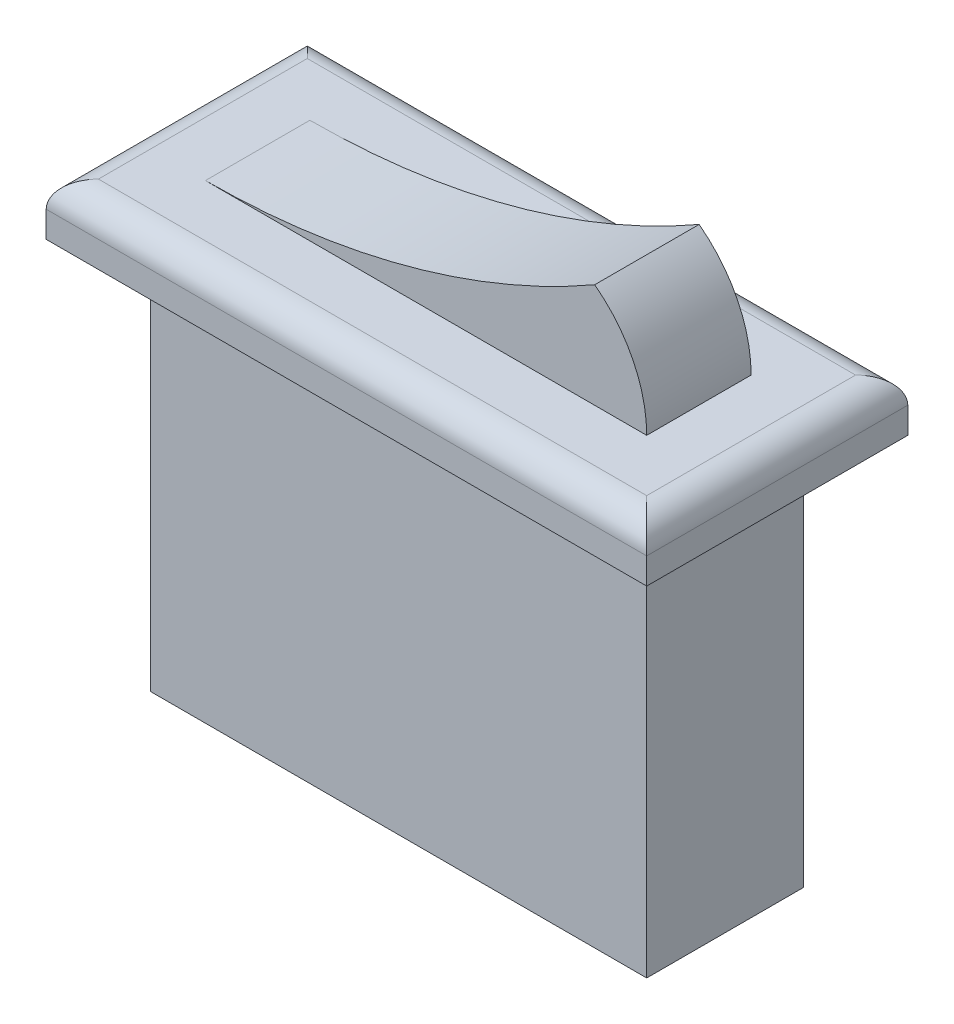
ISO-10303-21;
HEADER;
FILE_DESCRIPTION(('STEP AP214'),'2;1');
FILE_NAME('part.step','',(''),(''),'','','');
FILE_SCHEMA(('AUTOMOTIVE_DESIGN { 1 0 10303 214 1 1 1 1 }'));
ENDSEC;
DATA;
#1=APPLICATION_CONTEXT('core data for automotive mechanical design processes');
#2=APPLICATION_PROTOCOL_DEFINITION('international standard','automotive_design',2000,#1);
#3=PRODUCT_CONTEXT('',#1,'mechanical');
#4=PRODUCT('Part','Part','',(#3));
#5=PRODUCT_RELATED_PRODUCT_CATEGORY('part','',(#4));
#6=PRODUCT_DEFINITION_FORMATION('','',#4);
#7=PRODUCT_DEFINITION_CONTEXT('part definition',#1,'design');
#8=PRODUCT_DEFINITION('design','',#6,#7);
#9=PRODUCT_DEFINITION_SHAPE('','',#8);
#10=(LENGTH_UNIT() NAMED_UNIT(*) SI_UNIT(.MILLI.,.METRE.));
#11=(NAMED_UNIT(*) PLANE_ANGLE_UNIT() SI_UNIT($,.RADIAN.));
#12=(NAMED_UNIT(*) SI_UNIT($,.STERADIAN.) SOLID_ANGLE_UNIT());
#13=UNCERTAINTY_MEASURE_WITH_UNIT(LENGTH_MEASURE(1.E-05),#10,'distance_accuracy_value','');
#14=(GEOMETRIC_REPRESENTATION_CONTEXT(3) GLOBAL_UNCERTAINTY_ASSIGNED_CONTEXT((#13)) GLOBAL_UNIT_ASSIGNED_CONTEXT((#10,
#11,#12)) REPRESENTATION_CONTEXT('',''));
#15=CARTESIAN_POINT('',(0.,0.,0.));
#16=DIRECTION('',(0.,0.,1.));
#17=DIRECTION('',(1.,0.,0.));
#18=AXIS2_PLACEMENT_3D('',#15,#16,#17);
#19=CARTESIAN_POINT('',(-0.999999999999998,21.,-5.));
#20=DIRECTION('',(0.,0.,1.));
#21=DIRECTION('',(1.,0.,0.));
#22=AXIS2_PLACEMENT_3D('',#19,#20,#21);
#23=PLANE('',#22);
#24=DIRECTION('',(-1.,0.,0.));
#25=VECTOR('',#24,1.);
#26=CARTESIAN_POINT('',(-0.999999999999998,17.,-5.));
#27=LINE('',#26,#25);
#28=CARTESIAN_POINT('',(-0.999999999999998,17.,-5.));
#29=VERTEX_POINT('',#28);
#30=CARTESIAN_POINT('',(-17.9016002981503,17.,-5.));
#31=VERTEX_POINT('',#30);
#32=EDGE_CURVE('E146',#29,#31,#27,.T.);
#33=ORIENTED_EDGE('',*,*,#32,.T.);
#34=CARTESIAN_POINT('',(-17.9508001490719,46.972748130388,-5.));
#35=DIRECTION('',(0.,0.,-1.));
#36=DIRECTION('',(-1.,0.,0.));
#37=AXIS2_PLACEMENT_3D('',#34,#35,#36);
#38=CIRCLE('',#37,29.9727885107977);
#39=CARTESIAN_POINT('',(-2.99137483696735,21.,-5.));
#40=VERTEX_POINT('',#39);
#41=EDGE_CURVE('E131',#40,#31,#38,.T.);
#42=ORIENTED_EDGE('',*,*,#41,.F.);
#43=CARTESIAN_POINT('',(-6.01301246020367,17.,-5.));
#44=DIRECTION('',(0.,0.,-1.));
#45=DIRECTION('',(-1.,0.,0.));
#46=AXIS2_PLACEMENT_3D('',#43,#44,#45);
#47=CIRCLE('',#46,5.01301246020367);
#48=EDGE_CURVE('E144',#40,#29,#47,.T.);
#49=ORIENTED_EDGE('',*,*,#48,.T.);
#50=EDGE_LOOP('',(#33,#42,#49));
#51=FACE_BOUND('',#50,.T.);
#52=ADVANCED_FACE('F33',(#51),#23,.F.);
#53=CARTESIAN_POINT('',(-0.999999999999998,21.,-1.));
#54=DIRECTION('',(0.,0.,-1.));
#55=DIRECTION('',(-1.,0.,0.));
#56=AXIS2_PLACEMENT_3D('',#53,#54,#55);
#57=PLANE('',#56);
#58=CARTESIAN_POINT('',(-6.01301246020367,17.,-0.999999999999999));
#59=DIRECTION('',(0.,0.,-1.));
#60=DIRECTION('',(-1.,0.,0.));
#61=AXIS2_PLACEMENT_3D('',#58,#59,#60);
#62=CIRCLE('',#61,5.01301246020367);
#63=CARTESIAN_POINT('',(-2.99137483696735,21.,-1.));
#64=VERTEX_POINT('',#63);
#65=CARTESIAN_POINT('',(-0.999999999999998,17.,-1.));
#66=VERTEX_POINT('',#65);
#67=EDGE_CURVE('E140',#64,#66,#62,.T.);
#68=ORIENTED_EDGE('',*,*,#67,.F.);
#69=CARTESIAN_POINT('',(-17.9508001490719,46.972748130388,-0.999999999999998));
#70=DIRECTION('',(0.,0.,-1.));
#71=DIRECTION('',(-1.,0.,0.));
#72=AXIS2_PLACEMENT_3D('',#69,#70,#71);
#73=CIRCLE('',#72,29.9727885107977);
#74=CARTESIAN_POINT('',(-17.9016002981503,17.,-0.999999999999998));
#75=VERTEX_POINT('',#74);
#76=EDGE_CURVE('E134',#64,#75,#73,.T.);
#77=ORIENTED_EDGE('',*,*,#76,.T.);
#78=DIRECTION('',(1.,0.,0.));
#79=VECTOR('',#78,1.);
#80=CARTESIAN_POINT('',(-0.999999999999998,17.,-1.));
#81=LINE('',#80,#79);
#82=EDGE_CURVE('E157',#75,#66,#81,.T.);
#83=ORIENTED_EDGE('',*,*,#82,.T.);
#84=EDGE_LOOP('',(#68,#77,#83));
#85=FACE_BOUND('',#84,.T.);
#86=ADVANCED_FACE('F245',(#85),#57,.F.);
#87=CARTESIAN_POINT('',(0.,17.,0.));
#88=DIRECTION('',(0.,1.,0.));
#89=DIRECTION('',(0.,0.,1.));
#90=AXIS2_PLACEMENT_3D('',#87,#88,#89);
#91=PLANE('',#90);
#92=DIRECTION('',(-1.,0.,0.));
#93=VECTOR('',#92,1.);
#94=CARTESIAN_POINT('',(-21.,17.,-7.));
#95=LINE('',#94,#93);
#96=CARTESIAN_POINT('',(1.,17.,-7.));
#97=VERTEX_POINT('',#96);
#98=CARTESIAN_POINT('',(-20.,17.,-7.));
#99=VERTEX_POINT('',#98);
#100=EDGE_CURVE('E212',#97,#99,#95,.T.);
#101=ORIENTED_EDGE('',*,*,#100,.T.);
#102=DIRECTION('',(0.,0.,1.));
#103=VECTOR('',#102,1.);
#104=CARTESIAN_POINT('',(-20.,17.,2.));
#105=LINE('',#104,#103);
#106=CARTESIAN_POINT('',(-20.,17.,1.));
#107=VERTEX_POINT('',#106);
#108=EDGE_CURVE('E218',#99,#107,#105,.T.);
#109=ORIENTED_EDGE('',*,*,#108,.T.);
#110=DIRECTION('',(1.,0.,0.));
#111=VECTOR('',#110,1.);
#112=CARTESIAN_POINT('',(2.,17.,1.));
#113=LINE('',#112,#111);
#114=CARTESIAN_POINT('',(1.,17.,1.));
#115=VERTEX_POINT('',#114);
#116=EDGE_CURVE('E216',#107,#115,#113,.T.);
#117=ORIENTED_EDGE('',*,*,#116,.T.);
#118=DIRECTION('',(0.,0.,-1.));
#119=VECTOR('',#118,1.);
#120=CARTESIAN_POINT('',(1.,17.,-8.));
#121=LINE('',#120,#119);
#122=EDGE_CURVE('E214',#115,#97,#121,.T.);
#123=ORIENTED_EDGE('',*,*,#122,.T.);
#124=EDGE_LOOP('',(#101,#109,#117,#123));
#125=FACE_BOUND('',#124,.T.);
#126=ORIENTED_EDGE('',*,*,#82,.F.);
#127=DIRECTION('',(0.,0.,-1.));
#128=VECTOR('',#127,1.);
#129=CARTESIAN_POINT('',(-17.9016002981503,17.,-0.999999999999998));
#130=LINE('',#129,#128);
#131=EDGE_CURVE('E147',#75,#31,#130,.T.);
#132=ORIENTED_EDGE('',*,*,#131,.T.);
#133=ORIENTED_EDGE('',*,*,#32,.F.);
#134=DIRECTION('',(0.,0.,-1.));
#135=VECTOR('',#134,1.);
#136=CARTESIAN_POINT('',(-0.999999999999998,17.,-1.));
#137=LINE('',#136,#135);
#138=EDGE_CURVE('E139',#66,#29,#137,.T.);
#139=ORIENTED_EDGE('',*,*,#138,.F.);
#140=EDGE_LOOP('',(#126,#132,#133,#139));
#141=FACE_BOUND('',#140,.T.);
#142=ADVANCED_FACE('F244',(#125,#141),#91,.T.);
#143=CARTESIAN_POINT('',(0.,15.,0.));
#144=DIRECTION('',(-1.,0.,0.));
#145=DIRECTION('',(0.,0.,1.));
#146=AXIS2_PLACEMENT_3D('',#143,#144,#145);
#147=PLANE('',#146);
#148=DIRECTION('',(0.,0.,-1.));
#149=VECTOR('',#148,1.);
#150=CARTESIAN_POINT('',(0.,0.,0.));
#151=LINE('',#150,#149);
#152=CARTESIAN_POINT('',(0.,0.,0.));
#153=VERTEX_POINT('',#152);
#154=CARTESIAN_POINT('',(0.,0.,-6.));
#155=VERTEX_POINT('',#154);
#156=EDGE_CURVE('E179',#153,#155,#151,.T.);
#157=ORIENTED_EDGE('',*,*,#156,.T.);
#158=DIRECTION('',(0.,-1.,0.));
#159=VECTOR('',#158,1.);
#160=CARTESIAN_POINT('',(0.,15.,-6.));
#161=LINE('',#160,#159);
#162=CARTESIAN_POINT('',(0.,15.,-6.));
#163=VERTEX_POINT('',#162);
#164=EDGE_CURVE('E209',#163,#155,#161,.T.);
#165=ORIENTED_EDGE('',*,*,#164,.F.);
#166=DIRECTION('',(0.,0.,-1.));
#167=VECTOR('',#166,1.);
#168=CARTESIAN_POINT('',(0.,15.,0.));
#169=LINE('',#168,#167);
#170=CARTESIAN_POINT('',(0.,15.,0.));
#171=VERTEX_POINT('',#170);
#172=EDGE_CURVE('E180',#171,#163,#169,.T.);
#173=ORIENTED_EDGE('',*,*,#172,.F.);
#174=DIRECTION('',(0.,-1.,0.));
#175=VECTOR('',#174,1.);
#176=CARTESIAN_POINT('',(0.,15.,0.));
#177=LINE('',#176,#175);
#178=EDGE_CURVE('E193',#171,#153,#177,.T.);
#179=ORIENTED_EDGE('',*,*,#178,.T.);
#180=EDGE_LOOP('',(#157,#165,#173,#179));
#181=FACE_BOUND('',#180,.T.);
#182=ADVANCED_FACE('F252',(#181),#147,.F.);
#183=CARTESIAN_POINT('',(0.,15.,-6.));
#184=DIRECTION('',(0.,0.,1.));
#185=DIRECTION('',(1.,0.,0.));
#186=AXIS2_PLACEMENT_3D('',#183,#184,#185);
#187=PLANE('',#186);
#188=DIRECTION('',(-1.,0.,0.));
#189=VECTOR('',#188,1.);
#190=CARTESIAN_POINT('',(0.,0.,-6.));
#191=LINE('',#190,#189);
#192=CARTESIAN_POINT('',(-19.,0.,-6.));
#193=VERTEX_POINT('',#192);
#194=EDGE_CURVE('E196',#155,#193,#191,.T.);
#195=ORIENTED_EDGE('',*,*,#194,.T.);
#196=DIRECTION('',(0.,-1.,0.));
#197=VECTOR('',#196,1.);
#198=CARTESIAN_POINT('',(-19.,15.,-6.));
#199=LINE('',#198,#197);
#200=CARTESIAN_POINT('',(-19.,15.,-6.));
#201=VERTEX_POINT('',#200);
#202=EDGE_CURVE('E206',#201,#193,#199,.T.);
#203=ORIENTED_EDGE('',*,*,#202,.F.);
#204=DIRECTION('',(-1.,0.,0.));
#205=VECTOR('',#204,1.);
#206=CARTESIAN_POINT('',(0.,15.,-6.));
#207=LINE('',#206,#205);
#208=EDGE_CURVE('E183',#163,#201,#207,.T.);
#209=ORIENTED_EDGE('',*,*,#208,.F.);
#210=ORIENTED_EDGE('',*,*,#164,.T.);
#211=EDGE_LOOP('',(#195,#203,#209,#210));
#212=FACE_BOUND('',#211,.T.);
#213=ADVANCED_FACE('F288',(#212),#187,.F.);
#214=CARTESIAN_POINT('',(-19.,15.,0.));
#215=DIRECTION('',(1.,0.,0.));
#216=DIRECTION('',(0.,0.,-1.));
#217=AXIS2_PLACEMENT_3D('',#214,#215,#216);
#218=PLANE('',#217);
#219=DIRECTION('',(0.,0.,1.));
#220=VECTOR('',#219,1.);
#221=CARTESIAN_POINT('',(-19.,0.,0.));
#222=LINE('',#221,#220);
#223=CARTESIAN_POINT('',(-19.,0.,0.));
#224=VERTEX_POINT('',#223);
#225=EDGE_CURVE('E198',#193,#224,#222,.T.);
#226=ORIENTED_EDGE('',*,*,#225,.T.);
#227=DIRECTION('',(0.,-1.,0.));
#228=VECTOR('',#227,1.);
#229=CARTESIAN_POINT('',(-19.,15.,0.));
#230=LINE('',#229,#228);
#231=CARTESIAN_POINT('',(-19.,15.,0.));
#232=VERTEX_POINT('',#231);
#233=EDGE_CURVE('E203',#232,#224,#230,.T.);
#234=ORIENTED_EDGE('',*,*,#233,.F.);
#235=DIRECTION('',(0.,0.,1.));
#236=VECTOR('',#235,1.);
#237=CARTESIAN_POINT('',(-19.,15.,0.));
#238=LINE('',#237,#236);
#239=EDGE_CURVE('E187',#201,#232,#238,.T.);
#240=ORIENTED_EDGE('',*,*,#239,.F.);
#241=ORIENTED_EDGE('',*,*,#202,.T.);
#242=EDGE_LOOP('',(#226,#234,#240,#241));
#243=FACE_BOUND('',#242,.T.);
#244=ADVANCED_FACE('F284',(#243),#218,.F.);
#245=CARTESIAN_POINT('',(0.,15.,0.));
#246=DIRECTION('',(0.,0.,-1.));
#247=DIRECTION('',(-1.,0.,0.));
#248=AXIS2_PLACEMENT_3D('',#245,#246,#247);
#249=PLANE('',#248);
#250=DIRECTION('',(1.,0.,0.));
#251=VECTOR('',#250,1.);
#252=CARTESIAN_POINT('',(0.,0.,0.));
#253=LINE('',#252,#251);
#254=EDGE_CURVE('E184',#224,#153,#253,.T.);
#255=ORIENTED_EDGE('',*,*,#254,.T.);
#256=ORIENTED_EDGE('',*,*,#178,.F.);
#257=DIRECTION('',(1.,0.,0.));
#258=VECTOR('',#257,1.);
#259=CARTESIAN_POINT('',(0.,15.,0.));
#260=LINE('',#259,#258);
#261=EDGE_CURVE('E190',#232,#171,#260,.T.);
#262=ORIENTED_EDGE('',*,*,#261,.F.);
#263=ORIENTED_EDGE('',*,*,#233,.T.);
#264=EDGE_LOOP('',(#255,#256,#262,#263));
#265=FACE_BOUND('',#264,.T.);
#266=ADVANCED_FACE('F280',(#265),#249,.F.);
#267=CARTESIAN_POINT('',(0.,0.,0.));
#268=DIRECTION('',(0.,1.,0.));
#269=DIRECTION('',(0.,0.,1.));
#270=AXIS2_PLACEMENT_3D('',#267,#268,#269);
#271=PLANE('',#270);
#272=ORIENTED_EDGE('',*,*,#156,.F.);
#273=ORIENTED_EDGE('',*,*,#254,.F.);
#274=ORIENTED_EDGE('',*,*,#225,.F.);
#275=ORIENTED_EDGE('',*,*,#194,.F.);
#276=EDGE_LOOP('',(#272,#273,#274,#275));
#277=FACE_BOUND('',#276,.T.);
#278=ADVANCED_FACE('F263',(#277),#271,.F.);
#279=CARTESIAN_POINT('',(0.,15.,0.));
#280=DIRECTION('',(0.,1.,0.));
#281=DIRECTION('',(0.,0.,1.));
#282=AXIS2_PLACEMENT_3D('',#279,#280,#281);
#283=PLANE('',#282);
#284=DIRECTION('',(0.,0.,1.));
#285=VECTOR('',#284,1.);
#286=CARTESIAN_POINT('',(-21.,15.,-8.));
#287=LINE('',#286,#285);
#288=CARTESIAN_POINT('',(-21.,15.,-8.));
#289=VERTEX_POINT('',#288);
#290=CARTESIAN_POINT('',(-21.,15.,2.));
#291=VERTEX_POINT('',#290);
#292=EDGE_CURVE('E159',#289,#291,#287,.T.);
#293=ORIENTED_EDGE('',*,*,#292,.F.);
#294=DIRECTION('',(-1.,0.,0.));
#295=VECTOR('',#294,1.);
#296=CARTESIAN_POINT('',(-21.,15.,-8.));
#297=LINE('',#296,#295);
#298=CARTESIAN_POINT('',(2.,15.,-8.));
#299=VERTEX_POINT('',#298);
#300=EDGE_CURVE('E168',#299,#289,#297,.T.);
#301=ORIENTED_EDGE('',*,*,#300,.F.);
#302=DIRECTION('',(0.,0.,-1.));
#303=VECTOR('',#302,1.);
#304=CARTESIAN_POINT('',(2.,15.,-8.));
#305=LINE('',#304,#303);
#306=CARTESIAN_POINT('',(2.,15.,2.));
#307=VERTEX_POINT('',#306);
#308=EDGE_CURVE('E165',#307,#299,#305,.T.);
#309=ORIENTED_EDGE('',*,*,#308,.F.);
#310=DIRECTION('',(1.,0.,0.));
#311=VECTOR('',#310,1.);
#312=CARTESIAN_POINT('',(-21.,15.,2.));
#313=LINE('',#312,#311);
#314=EDGE_CURVE('E162',#291,#307,#313,.T.);
#315=ORIENTED_EDGE('',*,*,#314,.F.);
#316=EDGE_LOOP('',(#293,#301,#309,#315));
#317=FACE_BOUND('',#316,.T.);
#318=ORIENTED_EDGE('',*,*,#261,.T.);
#319=ORIENTED_EDGE('',*,*,#172,.T.);
#320=ORIENTED_EDGE('',*,*,#208,.T.);
#321=ORIENTED_EDGE('',*,*,#239,.T.);
#322=EDGE_LOOP('',(#318,#319,#320,#321));
#323=FACE_BOUND('',#322,.T.);
#324=ADVANCED_FACE('F259',(#317,#323),#283,.F.);
#325=CARTESIAN_POINT('',(-21.,17.,-8.));
#326=DIRECTION('',(1.,0.,0.));
#327=DIRECTION('',(0.,0.,-1.));
#328=AXIS2_PLACEMENT_3D('',#325,#326,#327);
#329=PLANE('',#328);
#330=DIRECTION('',(0.,-1.,0.));
#331=VECTOR('',#330,1.);
#332=CARTESIAN_POINT('',(-21.,17.,2.));
#333=LINE('',#332,#331);
#334=CARTESIAN_POINT('',(-21.,16.,2.));
#335=VERTEX_POINT('',#334);
#336=EDGE_CURVE('E177',#335,#291,#333,.T.);
#337=ORIENTED_EDGE('',*,*,#336,.F.);
#338=DIRECTION('',(0.,0.,1.));
#339=VECTOR('',#338,1.);
#340=CARTESIAN_POINT('',(-21.,16.,-8.));
#341=LINE('',#340,#339);
#342=CARTESIAN_POINT('',(-21.,16.,-8.));
#343=VERTEX_POINT('',#342);
#344=EDGE_CURVE('E221',#335,#343,#341,.F.);
#345=ORIENTED_EDGE('',*,*,#344,.T.);
#346=DIRECTION('',(0.,-1.,0.));
#347=VECTOR('',#346,1.);
#348=CARTESIAN_POINT('',(-21.,17.,-8.));
#349=LINE('',#348,#347);
#350=EDGE_CURVE('E171',#343,#289,#349,.T.);
#351=ORIENTED_EDGE('',*,*,#350,.T.);
#352=ORIENTED_EDGE('',*,*,#292,.T.);
#353=EDGE_LOOP('',(#337,#345,#351,#352));
#354=FACE_BOUND('',#353,.T.);
#355=ADVANCED_FACE('F262',(#354),#329,.F.);
#356=CARTESIAN_POINT('',(-21.,17.,2.));
#357=DIRECTION('',(0.,0.,-1.));
#358=DIRECTION('',(-1.,0.,0.));
#359=AXIS2_PLACEMENT_3D('',#356,#357,#358);
#360=PLANE('',#359);
#361=DIRECTION('',(0.,-1.,0.));
#362=VECTOR('',#361,1.);
#363=CARTESIAN_POINT('',(2.,17.,2.));
#364=LINE('',#363,#362);
#365=CARTESIAN_POINT('',(2.,16.,2.));
#366=VERTEX_POINT('',#365);
#367=EDGE_CURVE('E175',#366,#307,#364,.T.);
#368=ORIENTED_EDGE('',*,*,#367,.F.);
#369=DIRECTION('',(1.,0.,0.));
#370=VECTOR('',#369,1.);
#371=CARTESIAN_POINT('',(-21.,16.,2.));
#372=LINE('',#371,#370);
#373=EDGE_CURVE('E224',#366,#335,#372,.F.);
#374=ORIENTED_EDGE('',*,*,#373,.T.);
#375=ORIENTED_EDGE('',*,*,#336,.T.);
#376=ORIENTED_EDGE('',*,*,#314,.T.);
#377=EDGE_LOOP('',(#368,#374,#375,#376));
#378=FACE_BOUND('',#377,.T.);
#379=ADVANCED_FACE('F271',(#378),#360,.F.);
#380=CARTESIAN_POINT('',(2.,17.,-8.));
#381=DIRECTION('',(-1.,0.,0.));
#382=DIRECTION('',(0.,0.,1.));
#383=AXIS2_PLACEMENT_3D('',#380,#381,#382);
#384=PLANE('',#383);
#385=DIRECTION('',(0.,-1.,0.));
#386=VECTOR('',#385,1.);
#387=CARTESIAN_POINT('',(2.,17.,-8.));
#388=LINE('',#387,#386);
#389=CARTESIAN_POINT('',(2.,16.,-8.));
#390=VERTEX_POINT('',#389);
#391=EDGE_CURVE('E173',#390,#299,#388,.T.);
#392=ORIENTED_EDGE('',*,*,#391,.F.);
#393=DIRECTION('',(0.,0.,-1.));
#394=VECTOR('',#393,1.);
#395=CARTESIAN_POINT('',(2.,16.,2.));
#396=LINE('',#395,#394);
#397=EDGE_CURVE('E42',#390,#366,#396,.F.);
#398=ORIENTED_EDGE('',*,*,#397,.T.);
#399=ORIENTED_EDGE('',*,*,#367,.T.);
#400=ORIENTED_EDGE('',*,*,#308,.T.);
#401=EDGE_LOOP('',(#392,#398,#399,#400));
#402=FACE_BOUND('',#401,.T.);
#403=ADVANCED_FACE('F268',(#402),#384,.F.);
#404=CARTESIAN_POINT('',(-21.,17.,-8.));
#405=DIRECTION('',(0.,0.,1.));
#406=DIRECTION('',(1.,0.,0.));
#407=AXIS2_PLACEMENT_3D('',#404,#405,#406);
#408=PLANE('',#407);
#409=ORIENTED_EDGE('',*,*,#350,.F.);
#410=DIRECTION('',(-1.,0.,0.));
#411=VECTOR('',#410,1.);
#412=CARTESIAN_POINT('',(2.,16.,-8.));
#413=LINE('',#412,#411);
#414=EDGE_CURVE('E11',#343,#390,#413,.F.);
#415=ORIENTED_EDGE('',*,*,#414,.T.);
#416=ORIENTED_EDGE('',*,*,#391,.T.);
#417=ORIENTED_EDGE('',*,*,#300,.T.);
#418=EDGE_LOOP('',(#409,#415,#416,#417));
#419=FACE_BOUND('',#418,.T.);
#420=ADVANCED_FACE('F265',(#419),#408,.F.);
#421=CARTESIAN_POINT('',(-6.01301246020367,17.,-0.999999999999999));
#422=DIRECTION('',(0.,0.,-1.));
#423=DIRECTION('',(-1.,0.,0.));
#424=AXIS2_PLACEMENT_3D('',#421,#422,#423);
#425=CYLINDRICAL_SURFACE('',#424,5.01301246020367);
#426=ORIENTED_EDGE('',*,*,#48,.F.);
#427=DIRECTION('',(0.,0.,-1.));
#428=VECTOR('',#427,1.);
#429=CARTESIAN_POINT('',(-2.99137483696735,21.,-1.));
#430=LINE('',#429,#428);
#431=EDGE_CURVE('E128',#64,#40,#430,.T.);
#432=ORIENTED_EDGE('',*,*,#431,.F.);
#433=ORIENTED_EDGE('',*,*,#67,.T.);
#434=ORIENTED_EDGE('',*,*,#138,.T.);
#435=EDGE_LOOP('',(#426,#432,#433,#434));
#436=FACE_BOUND('',#435,.T.);
#437=ADVANCED_FACE('F149',(#436),#425,.T.);
#438=CARTESIAN_POINT('',(-17.9508001490719,46.972748130388,-0.999999999999998));
#439=DIRECTION('',(0.,0.,-1.));
#440=DIRECTION('',(-1.,0.,0.));
#441=AXIS2_PLACEMENT_3D('',#438,#439,#440);
#442=CYLINDRICAL_SURFACE('',#441,29.9727885107977);
#443=ORIENTED_EDGE('',*,*,#41,.T.);
#444=ORIENTED_EDGE('',*,*,#131,.F.);
#445=ORIENTED_EDGE('',*,*,#76,.F.);
#446=ORIENTED_EDGE('',*,*,#431,.T.);
#447=EDGE_LOOP('',(#443,#444,#445,#446));
#448=FACE_BOUND('',#447,.T.);
#449=ADVANCED_FACE('F130',(#448),#442,.F.);
#450=CARTESIAN_POINT('',(1.,16.,0.));
#451=DIRECTION('',(0.,0.,1.));
#452=DIRECTION('',(1.,0.,0.));
#453=AXIS2_PLACEMENT_3D('',#450,#451,#452);
#454=CYLINDRICAL_SURFACE('',#453,1.);
#455=CARTESIAN_POINT('',(1.,16.,1.));
#456=DIRECTION('',(-0.707106781186547,0.,0.707106781186547));
#457=DIRECTION('',(0.707106781186547,0.,0.707106781186547));
#458=AXIS2_PLACEMENT_3D('',#455,#456,#457);
#459=ELLIPSE('',#458,1.41421356237309,1.);
#460=EDGE_CURVE('E230',#366,#115,#459,.T.);
#461=ORIENTED_EDGE('',*,*,#460,.F.);
#462=ORIENTED_EDGE('',*,*,#397,.F.);
#463=CARTESIAN_POINT('',(1.,16.,-7.));
#464=DIRECTION('',(0.707106781186547,0.,0.707106781186547));
#465=DIRECTION('',(0.707106781186547,0.,-0.707106781186547));
#466=AXIS2_PLACEMENT_3D('',#463,#464,#465);
#467=ELLIPSE('',#466,1.41421356237309,1.);
#468=EDGE_CURVE('E37',#97,#390,#467,.F.);
#469=ORIENTED_EDGE('',*,*,#468,.F.);
#470=ORIENTED_EDGE('',*,*,#122,.F.);
#471=EDGE_LOOP('',(#461,#462,#469,#470));
#472=FACE_BOUND('',#471,.T.);
#473=ADVANCED_FACE('F35',(#472),#454,.T.);
#474=CARTESIAN_POINT('',(0.,16.,-7.));
#475=DIRECTION('',(1.,0.,0.));
#476=DIRECTION('',(0.,0.,-1.));
#477=AXIS2_PLACEMENT_3D('',#474,#475,#476);
#478=CYLINDRICAL_SURFACE('',#477,1.);
#479=ORIENTED_EDGE('',*,*,#468,.T.);
#480=ORIENTED_EDGE('',*,*,#414,.F.);
#481=CARTESIAN_POINT('',(-20.,16.,-7.));
#482=DIRECTION('',(0.707106781186547,0.,-0.707106781186547));
#483=DIRECTION('',(0.707106781186547,0.,0.707106781186547));
#484=AXIS2_PLACEMENT_3D('',#481,#482,#483);
#485=ELLIPSE('',#484,1.41421356237309,1.);
#486=EDGE_CURVE('E229',#99,#343,#485,.F.);
#487=ORIENTED_EDGE('',*,*,#486,.F.);
#488=ORIENTED_EDGE('',*,*,#100,.F.);
#489=EDGE_LOOP('',(#479,#480,#487,#488));
#490=FACE_BOUND('',#489,.T.);
#491=ADVANCED_FACE('F302',(#490),#478,.T.);
#492=CARTESIAN_POINT('',(0.,16.,1.));
#493=DIRECTION('',(-1.,0.,0.));
#494=DIRECTION('',(0.,0.,1.));
#495=AXIS2_PLACEMENT_3D('',#492,#493,#494);
#496=CYLINDRICAL_SURFACE('',#495,1.);
#497=ORIENTED_EDGE('',*,*,#460,.T.);
#498=ORIENTED_EDGE('',*,*,#116,.F.);
#499=CARTESIAN_POINT('',(-20.,16.,1.));
#500=DIRECTION('',(-0.707106781186547,0.,-0.707106781186547));
#501=DIRECTION('',(-0.707106781186547,0.,0.707106781186547));
#502=AXIS2_PLACEMENT_3D('',#499,#500,#501);
#503=ELLIPSE('',#502,1.41421356237309,1.);
#504=EDGE_CURVE('E227',#335,#107,#503,.T.);
#505=ORIENTED_EDGE('',*,*,#504,.F.);
#506=ORIENTED_EDGE('',*,*,#373,.F.);
#507=EDGE_LOOP('',(#497,#498,#505,#506));
#508=FACE_BOUND('',#507,.T.);
#509=ADVANCED_FACE('F299',(#508),#496,.T.);
#510=CARTESIAN_POINT('',(-20.,16.,0.));
#511=DIRECTION('',(0.,0.,-1.));
#512=DIRECTION('',(-1.,0.,0.));
#513=AXIS2_PLACEMENT_3D('',#510,#511,#512);
#514=CYLINDRICAL_SURFACE('',#513,1.);
#515=ORIENTED_EDGE('',*,*,#486,.T.);
#516=ORIENTED_EDGE('',*,*,#344,.F.);
#517=ORIENTED_EDGE('',*,*,#504,.T.);
#518=ORIENTED_EDGE('',*,*,#108,.F.);
#519=EDGE_LOOP('',(#515,#516,#517,#518));
#520=FACE_BOUND('',#519,.T.);
#521=ADVANCED_FACE('F296',(#520),#514,.T.);
#522=CLOSED_SHELL('',(#52,#86,#142,#182,#213,#244,#266,#278,#324,#355,#379,#403,#420,#437,#449,
#473,#491,#509,#521));
#523=MANIFOLD_SOLID_BREP('B2',#522);
#524=ADVANCED_BREP_SHAPE_REPRESENTATION('',(#18,#523),#14);
#525=SHAPE_DEFINITION_REPRESENTATION(#9,#524);
ENDSEC;
END-ISO-10303-21;
